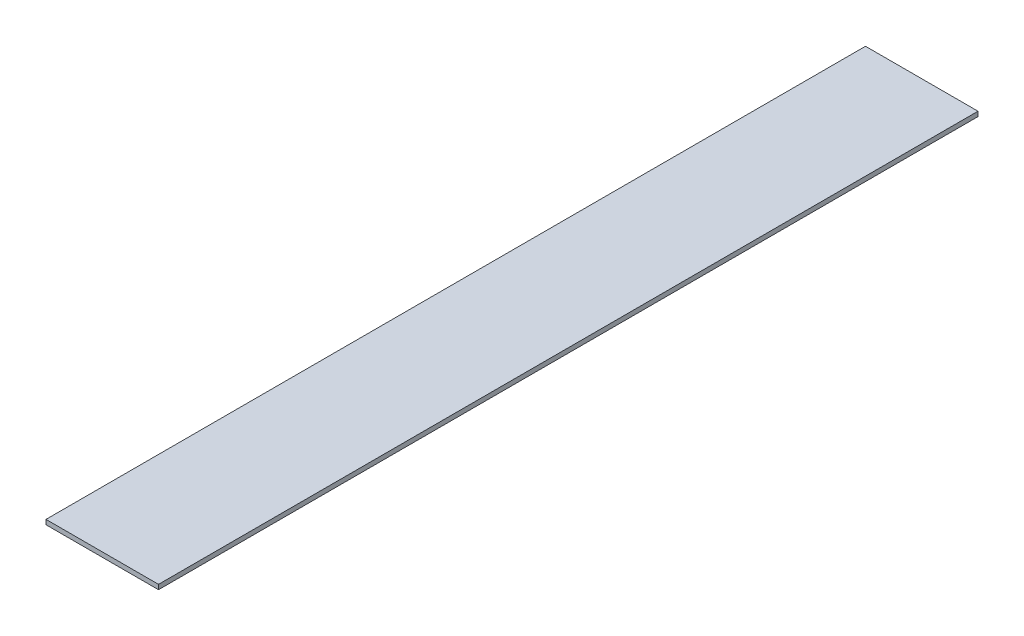
ISO-10303-21;
HEADER;
FILE_DESCRIPTION(('STEP AP214'),'2;1');
FILE_NAME('part.step','',(''),(''),'','','');
FILE_SCHEMA(('AUTOMOTIVE_DESIGN { 1 0 10303 214 1 1 1 1 }'));
ENDSEC;
DATA;
#1=APPLICATION_CONTEXT('core data for automotive mechanical design processes');
#2=APPLICATION_PROTOCOL_DEFINITION('international standard','automotive_design',2000,#1);
#3=PRODUCT_CONTEXT('',#1,'mechanical');
#4=PRODUCT('Part','Part','',(#3));
#5=PRODUCT_RELATED_PRODUCT_CATEGORY('part','',(#4));
#6=PRODUCT_DEFINITION_FORMATION('','',#4);
#7=PRODUCT_DEFINITION_CONTEXT('part definition',#1,'design');
#8=PRODUCT_DEFINITION('design','',#6,#7);
#9=PRODUCT_DEFINITION_SHAPE('','',#8);
#10=(LENGTH_UNIT() NAMED_UNIT(*) SI_UNIT(.MILLI.,.METRE.));
#11=(NAMED_UNIT(*) PLANE_ANGLE_UNIT() SI_UNIT($,.RADIAN.));
#12=(NAMED_UNIT(*) SI_UNIT($,.STERADIAN.) SOLID_ANGLE_UNIT());
#13=UNCERTAINTY_MEASURE_WITH_UNIT(LENGTH_MEASURE(1.E-05),#10,'distance_accuracy_value','');
#14=(GEOMETRIC_REPRESENTATION_CONTEXT(3) GLOBAL_UNCERTAINTY_ASSIGNED_CONTEXT((#13)) GLOBAL_UNIT_ASSIGNED_CONTEXT((#10,
#11,#12)) REPRESENTATION_CONTEXT('',''));
#15=CARTESIAN_POINT('',(0.,0.,0.));
#16=DIRECTION('',(0.,0.,1.));
#17=DIRECTION('',(1.,0.,0.));
#18=AXIS2_PLACEMENT_3D('',#15,#16,#17);
#19=CARTESIAN_POINT('',(0.,3.175,0.));
#20=DIRECTION('',(0.,-1.,0.));
#21=DIRECTION('',(0.,0.,-1.));
#22=AXIS2_PLACEMENT_3D('',#19,#20,#21);
#23=PLANE('',#22);
#24=DIRECTION('',(1.,0.,0.));
#25=VECTOR('',#24,1.);
#26=CARTESIAN_POINT('',(465.,3.175,277.5));
#27=LINE('',#26,#25);
#28=CARTESIAN_POINT('',(-465.,3.175,277.5));
#29=VERTEX_POINT('',#28);
#30=CARTESIAN_POINT('',(-388.8,3.175,277.5));
#31=VERTEX_POINT('',#30);
#32=EDGE_CURVE('E115',#29,#31,#27,.T.);
#33=ORIENTED_EDGE('',*,*,#32,.T.);
#34=DIRECTION('',(0.,0.,1.));
#35=VECTOR('',#34,1.);
#36=CARTESIAN_POINT('',(-388.8,3.175,-239.4));
#37=LINE('',#36,#35);
#38=CARTESIAN_POINT('',(-388.8,3.175,-277.5));
#39=VERTEX_POINT('',#38);
#40=EDGE_CURVE('E74',#39,#31,#37,.T.);
#41=ORIENTED_EDGE('',*,*,#40,.F.);
#42=DIRECTION('',(-1.,0.,0.));
#43=VECTOR('',#42,1.);
#44=CARTESIAN_POINT('',(465.,3.175,-277.5));
#45=LINE('',#44,#43);
#46=CARTESIAN_POINT('',(-465.,3.175,-277.5));
#47=VERTEX_POINT('',#46);
#48=EDGE_CURVE('E57',#39,#47,#45,.T.);
#49=ORIENTED_EDGE('',*,*,#48,.T.);
#50=DIRECTION('',(0.,0.,1.));
#51=VECTOR('',#50,1.);
#52=CARTESIAN_POINT('',(-465.,3.175,-277.5));
#53=LINE('',#52,#51);
#54=EDGE_CURVE('E106',#47,#29,#53,.T.);
#55=ORIENTED_EDGE('',*,*,#54,.T.);
#56=EDGE_LOOP('',(#33,#41,#49,#55));
#57=FACE_BOUND('',#56,.T.);
#58=ADVANCED_FACE('F39',(#57),#23,.F.);
#59=CARTESIAN_POINT('',(0.,0.,0.));
#60=DIRECTION('',(0.,-1.,0.));
#61=DIRECTION('',(0.,0.,-1.));
#62=AXIS2_PLACEMENT_3D('',#59,#60,#61);
#63=PLANE('',#62);
#64=DIRECTION('',(0.,0.,1.));
#65=VECTOR('',#64,1.);
#66=CARTESIAN_POINT('',(-388.8,0.,-239.4));
#67=LINE('',#66,#65);
#68=CARTESIAN_POINT('',(-388.8,0.,-277.5));
#69=VERTEX_POINT('',#68);
#70=CARTESIAN_POINT('',(-388.8,0.,277.5));
#71=VERTEX_POINT('',#70);
#72=EDGE_CURVE('E83',#69,#71,#67,.T.);
#73=ORIENTED_EDGE('',*,*,#72,.T.);
#74=DIRECTION('',(1.,0.,0.));
#75=VECTOR('',#74,1.);
#76=CARTESIAN_POINT('',(465.,0.,277.5));
#77=LINE('',#76,#75);
#78=CARTESIAN_POINT('',(-465.,0.,277.5));
#79=VERTEX_POINT('',#78);
#80=EDGE_CURVE('E69',#79,#71,#77,.T.);
#81=ORIENTED_EDGE('',*,*,#80,.F.);
#82=DIRECTION('',(0.,0.,1.));
#83=VECTOR('',#82,1.);
#84=CARTESIAN_POINT('',(-465.,0.,-277.5));
#85=LINE('',#84,#83);
#86=CARTESIAN_POINT('',(-465.,0.,-277.5));
#87=VERTEX_POINT('',#86);
#88=EDGE_CURVE('E102',#87,#79,#85,.T.);
#89=ORIENTED_EDGE('',*,*,#88,.F.);
#90=DIRECTION('',(-1.,0.,0.));
#91=VECTOR('',#90,1.);
#92=CARTESIAN_POINT('',(465.,0.,-277.5));
#93=LINE('',#92,#91);
#94=EDGE_CURVE('E86',#69,#87,#93,.T.);
#95=ORIENTED_EDGE('',*,*,#94,.F.);
#96=EDGE_LOOP('',(#73,#81,#89,#95));
#97=FACE_BOUND('',#96,.T.);
#98=ADVANCED_FACE('F85',(#97),#63,.T.);
#99=CARTESIAN_POINT('',(-465.,3.175,-277.5));
#100=DIRECTION('',(1.,0.,0.));
#101=DIRECTION('',(0.,0.,-1.));
#102=AXIS2_PLACEMENT_3D('',#99,#100,#101);
#103=PLANE('',#102);
#104=ORIENTED_EDGE('',*,*,#88,.T.);
#105=DIRECTION('',(0.,-1.,0.));
#106=VECTOR('',#105,1.);
#107=CARTESIAN_POINT('',(-465.,3.175,277.5));
#108=LINE('',#107,#106);
#109=EDGE_CURVE('E11',#29,#79,#108,.T.);
#110=ORIENTED_EDGE('',*,*,#109,.F.);
#111=ORIENTED_EDGE('',*,*,#54,.F.);
#112=DIRECTION('',(0.,-1.,0.));
#113=VECTOR('',#112,1.);
#114=CARTESIAN_POINT('',(-465.,3.175,-277.5));
#115=LINE('',#114,#113);
#116=EDGE_CURVE('E49',#47,#87,#115,.T.);
#117=ORIENTED_EDGE('',*,*,#116,.T.);
#118=EDGE_LOOP('',(#104,#110,#111,#117));
#119=FACE_BOUND('',#118,.T.);
#120=ADVANCED_FACE('F41',(#119),#103,.F.);
#121=CARTESIAN_POINT('',(465.,3.175,277.5));
#122=DIRECTION('',(0.,0.,-1.));
#123=DIRECTION('',(-1.,0.,0.));
#124=AXIS2_PLACEMENT_3D('',#121,#122,#123);
#125=PLANE('',#124);
#126=ORIENTED_EDGE('',*,*,#80,.T.);
#127=DIRECTION('',(0.,1.,0.));
#128=VECTOR('',#127,1.);
#129=CARTESIAN_POINT('',(-388.8,0.,277.5));
#130=LINE('',#129,#128);
#131=EDGE_CURVE('E93',#71,#31,#130,.T.);
#132=ORIENTED_EDGE('',*,*,#131,.T.);
#133=ORIENTED_EDGE('',*,*,#32,.F.);
#134=ORIENTED_EDGE('',*,*,#109,.T.);
#135=EDGE_LOOP('',(#126,#132,#133,#134));
#136=FACE_BOUND('',#135,.T.);
#137=ADVANCED_FACE('F98',(#136),#125,.F.);
#138=CARTESIAN_POINT('',(465.,3.175,-277.5));
#139=DIRECTION('',(0.,0.,1.));
#140=DIRECTION('',(1.,0.,0.));
#141=AXIS2_PLACEMENT_3D('',#138,#139,#140);
#142=PLANE('',#141);
#143=ORIENTED_EDGE('',*,*,#48,.F.);
#144=DIRECTION('',(0.,1.,0.));
#145=VECTOR('',#144,1.);
#146=CARTESIAN_POINT('',(-388.8,0.,-277.5));
#147=LINE('',#146,#145);
#148=EDGE_CURVE('E90',#69,#39,#147,.T.);
#149=ORIENTED_EDGE('',*,*,#148,.F.);
#150=ORIENTED_EDGE('',*,*,#94,.T.);
#151=ORIENTED_EDGE('',*,*,#116,.F.);
#152=EDGE_LOOP('',(#143,#149,#150,#151));
#153=FACE_BOUND('',#152,.T.);
#154=ADVANCED_FACE('F125',(#153),#142,.F.);
#155=CARTESIAN_POINT('',(-388.8,3.175,-239.4));
#156=DIRECTION('',(1.,0.,0.));
#157=DIRECTION('',(0.,0.,-1.));
#158=AXIS2_PLACEMENT_3D('',#155,#156,#157);
#159=PLANE('',#158);
#160=ORIENTED_EDGE('',*,*,#72,.F.);
#161=ORIENTED_EDGE('',*,*,#148,.T.);
#162=ORIENTED_EDGE('',*,*,#40,.T.);
#163=ORIENTED_EDGE('',*,*,#131,.F.);
#164=EDGE_LOOP('',(#160,#161,#162,#163));
#165=FACE_BOUND('',#164,.T.);
#166=ADVANCED_FACE('F94',(#165),#159,.T.);
#167=CLOSED_SHELL('',(#58,#98,#120,#137,#154,#166));
#168=MANIFOLD_SOLID_BREP('B2',#167);
#169=ADVANCED_BREP_SHAPE_REPRESENTATION('',(#18,#168),#14);
#170=SHAPE_DEFINITION_REPRESENTATION(#9,#169);
ENDSEC;
END-ISO-10303-21;
